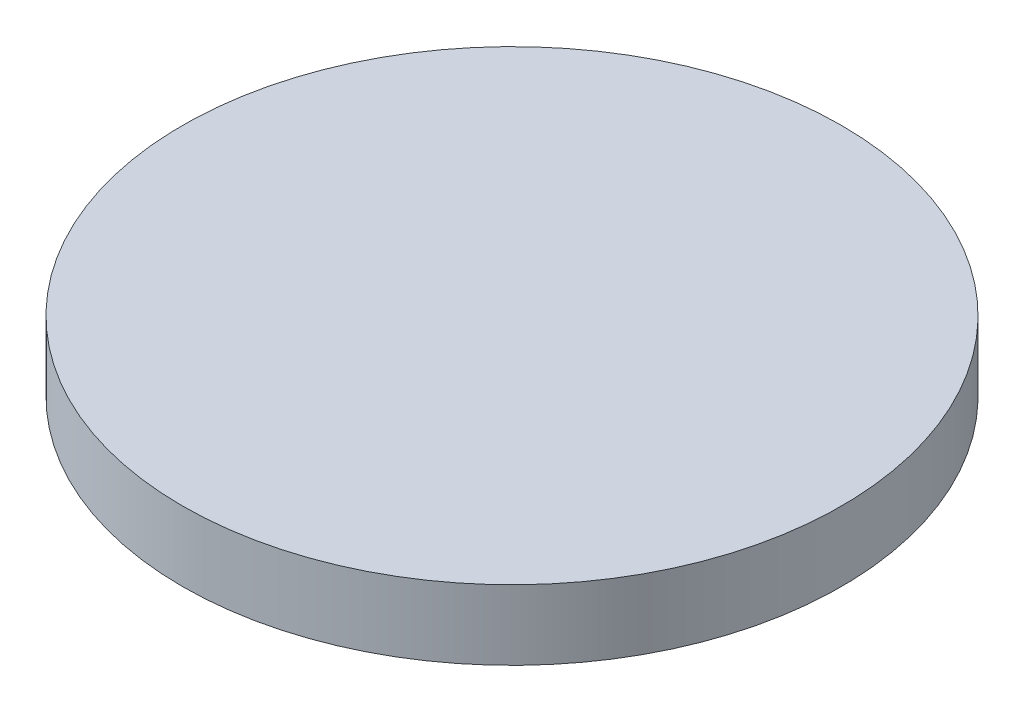
ISO-10303-21;
HEADER;
FILE_DESCRIPTION(('STEP AP214'),'2;1');
FILE_NAME('part.step','',(''),(''),'','','');
FILE_SCHEMA(('AUTOMOTIVE_DESIGN { 1 0 10303 214 1 1 1 1 }'));
ENDSEC;
DATA;
#1=APPLICATION_CONTEXT('core data for automotive mechanical design processes');
#2=APPLICATION_PROTOCOL_DEFINITION('international standard','automotive_design',2000,#1);
#3=PRODUCT_CONTEXT('',#1,'mechanical');
#4=PRODUCT('Part','Part','',(#3));
#5=PRODUCT_RELATED_PRODUCT_CATEGORY('part','',(#4));
#6=PRODUCT_DEFINITION_FORMATION('','',#4);
#7=PRODUCT_DEFINITION_CONTEXT('part definition',#1,'design');
#8=PRODUCT_DEFINITION('design','',#6,#7);
#9=PRODUCT_DEFINITION_SHAPE('','',#8);
#10=(LENGTH_UNIT() NAMED_UNIT(*) SI_UNIT(.MILLI.,.METRE.));
#11=(NAMED_UNIT(*) PLANE_ANGLE_UNIT() SI_UNIT($,.RADIAN.));
#12=(NAMED_UNIT(*) SI_UNIT($,.STERADIAN.) SOLID_ANGLE_UNIT());
#13=UNCERTAINTY_MEASURE_WITH_UNIT(LENGTH_MEASURE(1.E-05),#10,'distance_accuracy_value','');
#14=(GEOMETRIC_REPRESENTATION_CONTEXT(3) GLOBAL_UNCERTAINTY_ASSIGNED_CONTEXT((#13)) GLOBAL_UNIT_ASSIGNED_CONTEXT((#10,
#11,#12)) REPRESENTATION_CONTEXT('',''));
#15=CARTESIAN_POINT('',(0.,0.,0.));
#16=DIRECTION('',(0.,0.,1.));
#17=DIRECTION('',(1.,0.,0.));
#18=AXIS2_PLACEMENT_3D('',#15,#16,#17);
#19=CARTESIAN_POINT('',(0.,1.5875,0.));
#20=DIRECTION('',(0.,-1.,0.));
#21=DIRECTION('',(0.,0.,-1.));
#22=AXIS2_PLACEMENT_3D('',#19,#20,#21);
#23=CYLINDRICAL_SURFACE('',#22,7.493);
#24=CARTESIAN_POINT('',(0.,1.5875,0.));
#25=DIRECTION('',(0.,1.,0.));
#26=DIRECTION('',(0.,0.,1.));
#27=AXIS2_PLACEMENT_3D('',#24,#25,#26);
#28=CIRCLE('',#27,7.493);
#29=CARTESIAN_POINT('',(0.,1.5875,7.493));
#30=VERTEX_POINT('',#29);
#31=EDGE_CURVE('E10',#30,#30,#28,.T.);
#32=ORIENTED_EDGE('',*,*,#31,.F.);
#33=EDGE_LOOP('',(#32));
#34=FACE_BOUND('',#33,.T.);
#35=CARTESIAN_POINT('',(0.,0.,0.));
#36=DIRECTION('',(0.,1.,0.));
#37=DIRECTION('',(0.,0.,1.));
#38=AXIS2_PLACEMENT_3D('',#35,#36,#37);
#39=CIRCLE('',#38,7.493);
#40=CARTESIAN_POINT('',(0.,0.,7.493));
#41=VERTEX_POINT('',#40);
#42=EDGE_CURVE('E40',#41,#41,#39,.T.);
#43=ORIENTED_EDGE('',*,*,#42,.T.);
#44=EDGE_LOOP('',(#43));
#45=FACE_BOUND('',#44,.T.);
#46=ADVANCED_FACE('F34',(#34,#45),#23,.T.);
#47=CARTESIAN_POINT('',(0.,1.5875,0.));
#48=DIRECTION('',(0.,1.,0.));
#49=DIRECTION('',(0.,0.,1.));
#50=AXIS2_PLACEMENT_3D('',#47,#48,#49);
#51=PLANE('',#50);
#52=ORIENTED_EDGE('',*,*,#31,.T.);
#53=EDGE_LOOP('',(#52));
#54=FACE_BOUND('',#53,.T.);
#55=ADVANCED_FACE('F49',(#54),#51,.T.);
#56=CARTESIAN_POINT('',(0.,0.,0.));
#57=DIRECTION('',(0.,1.,0.));
#58=DIRECTION('',(0.,0.,1.));
#59=AXIS2_PLACEMENT_3D('',#56,#57,#58);
#60=PLANE('',#59);
#61=ORIENTED_EDGE('',*,*,#42,.F.);
#62=EDGE_LOOP('',(#61));
#63=FACE_BOUND('',#62,.T.);
#64=ADVANCED_FACE('F47',(#63),#60,.F.);
#65=CLOSED_SHELL('',(#46,#55,#64));
#66=MANIFOLD_SOLID_BREP('B2',#65);
#67=ADVANCED_BREP_SHAPE_REPRESENTATION('',(#18,#66),#14);
#68=SHAPE_DEFINITION_REPRESENTATION(#9,#67);
ENDSEC;
END-ISO-10303-21;
